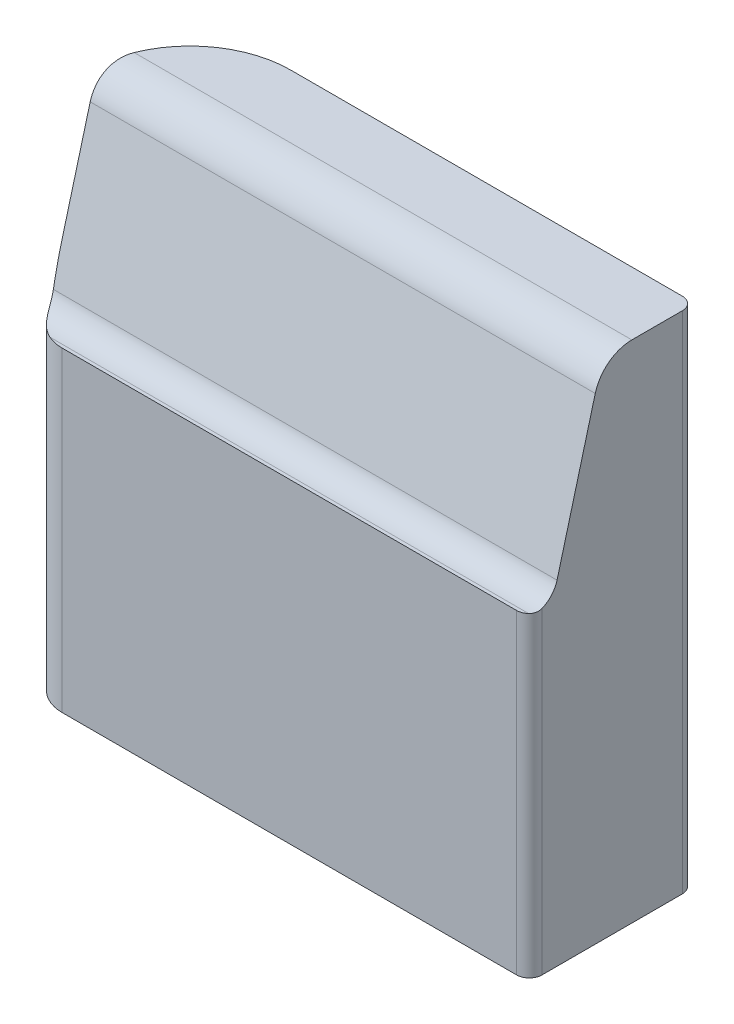
ISO-10303-21;
HEADER;
FILE_DESCRIPTION(('STEP AP214'),'2;1');
FILE_NAME('part.step','',(''),(''),'','','');
FILE_SCHEMA(('AUTOMOTIVE_DESIGN { 1 0 10303 214 1 1 1 1 }'));
ENDSEC;
DATA;
#1=APPLICATION_CONTEXT('core data for automotive mechanical design processes');
#2=APPLICATION_PROTOCOL_DEFINITION('international standard','automotive_design',2000,#1);
#3=PRODUCT_CONTEXT('',#1,'mechanical');
#4=PRODUCT('Part','Part','',(#3));
#5=PRODUCT_RELATED_PRODUCT_CATEGORY('part','',(#4));
#6=PRODUCT_DEFINITION_FORMATION('','',#4);
#7=PRODUCT_DEFINITION_CONTEXT('part definition',#1,'design');
#8=PRODUCT_DEFINITION('design','',#6,#7);
#9=PRODUCT_DEFINITION_SHAPE('','',#8);
#10=(LENGTH_UNIT() NAMED_UNIT(*) SI_UNIT(.MILLI.,.METRE.));
#11=(NAMED_UNIT(*) PLANE_ANGLE_UNIT() SI_UNIT($,.RADIAN.));
#12=(NAMED_UNIT(*) SI_UNIT($,.STERADIAN.) SOLID_ANGLE_UNIT());
#13=UNCERTAINTY_MEASURE_WITH_UNIT(LENGTH_MEASURE(1.E-05),#10,'distance_accuracy_value','');
#14=(GEOMETRIC_REPRESENTATION_CONTEXT(3) GLOBAL_UNCERTAINTY_ASSIGNED_CONTEXT((#13)) GLOBAL_UNIT_ASSIGNED_CONTEXT((#10,
#11,#12)) REPRESENTATION_CONTEXT('',''));
#15=CARTESIAN_POINT('',(0.,0.,0.));
#16=DIRECTION('',(0.,0.,1.));
#17=DIRECTION('',(1.,0.,0.));
#18=AXIS2_PLACEMENT_3D('',#15,#16,#17);
#19=CARTESIAN_POINT('',(20.,-3.,5.));
#20=DIRECTION('',(-1.,0.,0.));
#21=DIRECTION('',(0.,0.,1.));
#22=AXIS2_PLACEMENT_3D('',#19,#20,#21);
#23=CYLINDRICAL_SURFACE('',#22,3.);
#24=DIRECTION('',(-1.,0.,0.));
#25=VECTOR('',#24,1.);
#26=CARTESIAN_POINT('',(20.,0.,5.));
#27=LINE('',#26,#25);
#28=CARTESIAN_POINT('',(20.,0.,5.));
#29=VERTEX_POINT('',#28);
#30=CARTESIAN_POINT('',(-19.4161984870957,0.,5.));
#31=VERTEX_POINT('',#30);
#32=EDGE_CURVE('E184',#29,#31,#27,.T.);
#33=ORIENTED_EDGE('',*,*,#32,.T.);
#34=CARTESIAN_POINT('',(-19.4161984870957,0.,5.));
#35=CARTESIAN_POINT('',(-19.4476398910571,8.44615215946744E-06,5.07769598822021));
#36=CARTESIAN_POINT('',(-19.4778448347174,-0.00301875547096458,5.155905999336));
#37=CARTESIAN_POINT('',(-19.5356515093298,-0.0153183936879546,5.3128258372859));
#38=CARTESIAN_POINT('',(-19.5632522820662,-0.0245931189469453,5.39153583681081));
#39=CARTESIAN_POINT('',(-19.6157162275312,-0.0495711248398902,5.54892712936012));
#40=CARTESIAN_POINT('',(-19.6405773852055,-0.0652790977595611,5.62760835938605));
#41=CARTESIAN_POINT('',(-19.6874565688875,-0.103189547508719,5.78421388711505));
#42=CARTESIAN_POINT('',(-19.7094750016502,-0.125391093708975,5.8621382916306));
#43=CARTESIAN_POINT('',(-19.771329198685,-0.201933977518062,6.09422279218903));
#44=CARTESIAN_POINT('',(-19.8068739890091,-0.266171386367017,6.2464211560772));
#45=CARTESIAN_POINT('',(-19.8669872290354,-0.419842800390661,6.53953554478387));
#46=CARTESIAN_POINT('',(-19.8915692423017,-0.509245445419557,6.68046533324962));
#47=CARTESIAN_POINT('',(-19.9307456722422,-0.707411825846414,6.94164253575932));
#48=CARTESIAN_POINT('',(-19.9456596657797,-0.815388020681755,7.0624413560816));
#49=CARTESIAN_POINT('',(-19.9688210405371,-1.04995090657302,7.28549813096223));
#50=CARTESIAN_POINT('',(-19.9770612888708,-1.17655733931868,7.38773615750423));
#51=CARTESIAN_POINT('',(-19.9861108573365,-1.38001634318352,7.52641157421995));
#52=CARTESIAN_POINT('',(-19.9885878620751,-1.45149140429164,7.57083734672452));
#53=CARTESIAN_POINT('',(-19.9926020993526,-1.59796188968992,7.6535548795928));
#54=CARTESIAN_POINT('',(-19.9941392743925,-1.67295752906751,7.69184626454784));
#55=CARTESIAN_POINT('',(-19.9965356521875,-1.82586769254523,7.76197118100954));
#56=CARTESIAN_POINT('',(-19.9973951939427,-1.90378073669086,7.79380793565077));
#57=CARTESIAN_POINT('',(-19.9986580518514,-2.06200274569308,7.85083227948489));
#58=CARTESIAN_POINT('',(-19.9990613891509,-2.14231159932233,7.8760201768232));
#59=CARTESIAN_POINT('',(-19.9993468831007,-2.22354286469243,7.8977774788672));
#60=B_SPLINE_CURVE_WITH_KNOTS('',3,(#34,#35,#36,#37,#38,#39,#40,#41,#42,#43,#44,#45,#46,#47,#48,
#49,#50,#51,#52,#53,#54,#55,#56,#57,#58,#59),.UNSPECIFIED.,.F.,.F.,(4,2,2,2,2,2,2,2,2,2,2,2,4),
(0.,0.251402016056363,0.502896178728765,0.754574103963112,1.00621597752705,1.51035980882775,
2.01387815194398,2.49976580321802,2.98617208748072,3.23850001379153,3.4908433760256,
3.74306041796446,3.99526576869457),.UNSPECIFIED.);
#61=CARTESIAN_POINT('',(-19.9993468831007,-2.22354286469243,7.8977774788672));
#62=VERTEX_POINT('',#61);
#63=EDGE_CURVE('E259',#31,#62,#60,.T.);
#64=ORIENTED_EDGE('',*,*,#63,.T.);
#65=DIRECTION('',(-1.,0.,0.));
#66=VECTOR('',#65,1.);
#67=CARTESIAN_POINT('',(20.,-2.22354286469243,7.8977774788672));
#68=LINE('',#67,#66);
#69=CARTESIAN_POINT('',(20.,-2.22354286469243,7.8977774788672));
#70=VERTEX_POINT('',#69);
#71=EDGE_CURVE('E201',#70,#62,#68,.T.);
#72=ORIENTED_EDGE('',*,*,#71,.F.);
#73=CARTESIAN_POINT('',(20.,-3.,5.));
#74=DIRECTION('',(1.,0.,0.));
#75=DIRECTION('',(0.,0.,1.));
#76=AXIS2_PLACEMENT_3D('',#73,#74,#75);
#77=CIRCLE('',#76,3.);
#78=EDGE_CURVE('E172',#29,#70,#77,.T.);
#79=ORIENTED_EDGE('',*,*,#78,.F.);
#80=EDGE_LOOP('',(#33,#64,#72,#79));
#81=FACE_BOUND('',#80,.T.);
#82=ADVANCED_FACE('F51',(#81),#23,.T.);
#83=CARTESIAN_POINT('',(20.,-15.,11.3212188504038));
#84=DIRECTION('',(0.,-0.258819045102525,-0.965925826289067));
#85=DIRECTION('',(0.,0.965925826289067,-0.258819045102525));
#86=AXIS2_PLACEMENT_3D('',#83,#84,#85);
#87=PLANE('',#86);
#88=DIRECTION('',(0.,-0.965925826289067,0.258819045102525));
#89=VECTOR('',#88,1.);
#90=CARTESIAN_POINT('',(-20.,-15.,11.3212188504038));
#91=LINE('',#90,#89);
#92=CARTESIAN_POINT('',(-20.,-2.60504250723782,8.));
#93=VERTEX_POINT('',#92);
#94=CARTESIAN_POINT('',(-20.,-10.5169902192837,10.12));
#95=VERTEX_POINT('',#94);
#96=EDGE_CURVE('E171',#93,#95,#91,.T.);
#97=ORIENTED_EDGE('',*,*,#96,.T.);
#98=CARTESIAN_POINT('',(-17.,-10.5169902192837,10.12));
#99=DIRECTION('',(0.,-0.258819045102525,-0.965925826289067));
#100=DIRECTION('',(0.,0.965925826289067,-0.258819045102525));
#101=AXIS2_PLACEMENT_3D('',#98,#99,#100);
#102=ELLIPSE('',#101,11.5911099154686,3.);
#103=CARTESIAN_POINT('',(-19.8902508458796,-13.5176380902051,10.9240211737836));
#104=VERTEX_POINT('',#103);
#105=EDGE_CURVE('E74',#95,#104,#102,.F.);
#106=ORIENTED_EDGE('',*,*,#105,.T.);
#107=DIRECTION('',(-1.,0.,0.));
#108=VECTOR('',#107,1.);
#109=CARTESIAN_POINT('',(20.,-13.5176380902051,10.9240211737836));
#110=LINE('',#109,#108);
#111=CARTESIAN_POINT('',(20.,-13.5176380902051,10.9240211737836));
#112=VERTEX_POINT('',#111);
#113=EDGE_CURVE('E225',#104,#112,#110,.F.);
#114=ORIENTED_EDGE('',*,*,#113,.T.);
#115=DIRECTION('',(0.,-0.965925826289067,0.258819045102525));
#116=VECTOR('',#115,1.);
#117=CARTESIAN_POINT('',(20.,-15.,11.3212188504038));
#118=LINE('',#117,#116);
#119=EDGE_CURVE('E175',#70,#112,#118,.T.);
#120=ORIENTED_EDGE('',*,*,#119,.F.);
#121=ORIENTED_EDGE('',*,*,#71,.T.);
#122=CARTESIAN_POINT('',(-12.,-2.60504250723782,8.));
#123=DIRECTION('',(0.,-0.258819045102525,-0.965925826289067));
#124=DIRECTION('',(0.,-0.965925826289067,0.258819045102525));
#125=AXIS2_PLACEMENT_3D('',#122,#123,#124);
#126=ELLIPSE('',#125,30.9096264412497,8.);
#127=EDGE_CURVE('E265',#62,#93,#126,.F.);
#128=ORIENTED_EDGE('',*,*,#127,.T.);
#129=EDGE_LOOP('',(#97,#106,#114,#120,#121,#128));
#130=FACE_BOUND('',#129,.T.);
#131=ADVANCED_FACE('F255',(#130),#87,.F.);
#132=CARTESIAN_POINT('',(20.,-15.,13.12));
#133=DIRECTION('',(0.,-1.,0.));
#134=DIRECTION('',(0.,0.,-1.));
#135=AXIS2_PLACEMENT_3D('',#132,#133,#134);
#136=PLANE('',#135);
#137=DIRECTION('',(-1.,0.,0.));
#138=VECTOR('',#137,1.);
#139=CARTESIAN_POINT('',(-20.,-15.,12.8558728263617));
#140=LINE('',#139,#138);
#141=CARTESIAN_POINT('',(19.6771197703674,-15.,12.8558728263617));
#142=VERTEX_POINT('',#141);
#143=CARTESIAN_POINT('',(-18.2308533129401,-15.,12.8558728263617));
#144=VERTEX_POINT('',#143);
#145=EDGE_CURVE('E223',#142,#144,#140,.T.);
#146=ORIENTED_EDGE('',*,*,#145,.T.);
#147=CARTESIAN_POINT('',(-17.,-15.,10.12));
#148=DIRECTION('',(0.,-1.,0.));
#149=DIRECTION('',(0.,0.,-1.));
#150=AXIS2_PLACEMENT_3D('',#147,#148,#149);
#151=CIRCLE('',#150,3.);
#152=CARTESIAN_POINT('',(-17.,-15.,13.12));
#153=VERTEX_POINT('',#152);
#154=EDGE_CURVE('E11',#144,#153,#151,.F.);
#155=ORIENTED_EDGE('',*,*,#154,.T.);
#156=DIRECTION('',(-1.,0.,0.));
#157=VECTOR('',#156,1.);
#158=CARTESIAN_POINT('',(20.,-15.,13.12));
#159=LINE('',#158,#157);
#160=CARTESIAN_POINT('',(19.,-15.,13.12));
#161=VERTEX_POINT('',#160);
#162=EDGE_CURVE('E198',#161,#153,#159,.T.);
#163=ORIENTED_EDGE('',*,*,#162,.F.);
#164=CARTESIAN_POINT('',(19.,-15.,12.12));
#165=DIRECTION('',(0.,-1.,0.));
#166=DIRECTION('',(0.,0.,-1.));
#167=AXIS2_PLACEMENT_3D('',#164,#165,#166);
#168=CIRCLE('',#167,1.);
#169=EDGE_CURVE('E220',#161,#142,#168,.F.);
#170=ORIENTED_EDGE('',*,*,#169,.T.);
#171=EDGE_LOOP('',(#146,#155,#163,#170));
#172=FACE_BOUND('',#171,.T.);
#173=ADVANCED_FACE('F311',(#172),#136,.F.);
#174=CARTESIAN_POINT('',(20.,-40.,13.12));
#175=DIRECTION('',(0.,0.,-1.));
#176=DIRECTION('',(-1.,0.,0.));
#177=AXIS2_PLACEMENT_3D('',#174,#175,#176);
#178=PLANE('',#177);
#179=ORIENTED_EDGE('',*,*,#162,.T.);
#180=DIRECTION('',(0.,-1.,0.));
#181=VECTOR('',#180,1.);
#182=CARTESIAN_POINT('',(-17.,-40.,13.12));
#183=LINE('',#182,#181);
#184=CARTESIAN_POINT('',(-17.,-40.,13.12));
#185=VERTEX_POINT('',#184);
#186=EDGE_CURVE('E290',#153,#185,#183,.T.);
#187=ORIENTED_EDGE('',*,*,#186,.T.);
#188=DIRECTION('',(-1.,0.,0.));
#189=VECTOR('',#188,1.);
#190=CARTESIAN_POINT('',(20.,-40.,13.12));
#191=LINE('',#190,#189);
#192=CARTESIAN_POINT('',(19.,-40.,13.12));
#193=VERTEX_POINT('',#192);
#194=EDGE_CURVE('E195',#193,#185,#191,.T.);
#195=ORIENTED_EDGE('',*,*,#194,.F.);
#196=DIRECTION('',(0.,-1.,0.));
#197=VECTOR('',#196,1.);
#198=CARTESIAN_POINT('',(19.,-40.,13.12));
#199=LINE('',#198,#197);
#200=EDGE_CURVE('E218',#193,#161,#199,.F.);
#201=ORIENTED_EDGE('',*,*,#200,.T.);
#202=EDGE_LOOP('',(#179,#187,#195,#201));
#203=FACE_BOUND('',#202,.T.);
#204=ADVANCED_FACE('F314',(#203),#178,.F.);
#205=CARTESIAN_POINT('',(20.,-40.,0.));
#206=DIRECTION('',(0.,1.,0.));
#207=DIRECTION('',(0.,0.,1.));
#208=AXIS2_PLACEMENT_3D('',#205,#206,#207);
#209=PLANE('',#208);
#210=CARTESIAN_POINT('',(13.,-40.,6.56));
#211=DIRECTION('',(0.,-1.,0.));
#212=DIRECTION('',(0.,0.,-1.));
#213=AXIS2_PLACEMENT_3D('',#210,#211,#212);
#214=CIRCLE('',#213,3.025);
#215=CARTESIAN_POINT('',(13.,-40.,3.535));
#216=VERTEX_POINT('',#215);
#217=EDGE_CURVE('E162',#216,#216,#214,.T.);
#218=ORIENTED_EDGE('',*,*,#217,.F.);
#219=EDGE_LOOP('',(#218));
#220=FACE_BOUND('',#219,.T.);
#221=CARTESIAN_POINT('',(-9.86933288150908,-40.,6.56));
#222=DIRECTION('',(0.,-1.,0.));
#223=DIRECTION('',(0.,0.,-1.));
#224=AXIS2_PLACEMENT_3D('',#221,#222,#223);
#225=CIRCLE('',#224,3.025);
#226=CARTESIAN_POINT('',(-9.86933288150908,-40.,3.535));
#227=VERTEX_POINT('',#226);
#228=EDGE_CURVE('E155',#227,#227,#225,.T.);
#229=ORIENTED_EDGE('',*,*,#228,.F.);
#230=EDGE_LOOP('',(#229));
#231=FACE_BOUND('',#230,.T.);
#232=ORIENTED_EDGE('',*,*,#194,.T.);
#233=CARTESIAN_POINT('',(-17.,-40.,10.12));
#234=DIRECTION('',(0.,1.,0.));
#235=DIRECTION('',(0.,0.,1.));
#236=AXIS2_PLACEMENT_3D('',#233,#234,#235);
#237=CIRCLE('',#236,3.);
#238=CARTESIAN_POINT('',(-20.,-40.,10.12));
#239=VERTEX_POINT('',#238);
#240=EDGE_CURVE('E293',#185,#239,#237,.F.);
#241=ORIENTED_EDGE('',*,*,#240,.T.);
#242=DIRECTION('',(0.,0.,-1.));
#243=VECTOR('',#242,1.);
#244=CARTESIAN_POINT('',(-20.,-40.,0.));
#245=LINE('',#244,#243);
#246=CARTESIAN_POINT('',(-20.,-40.,7.99999999999999));
#247=VERTEX_POINT('',#246);
#248=EDGE_CURVE('E176',#239,#247,#245,.T.);
#249=ORIENTED_EDGE('',*,*,#248,.T.);
#250=CARTESIAN_POINT('',(-12.,-40.,7.99999999999999));
#251=DIRECTION('',(0.,1.,0.));
#252=DIRECTION('',(0.,0.,1.));
#253=AXIS2_PLACEMENT_3D('',#250,#251,#252);
#254=CIRCLE('',#253,8.);
#255=CARTESIAN_POINT('',(-12.,-40.,0.));
#256=VERTEX_POINT('',#255);
#257=EDGE_CURVE('E283',#247,#256,#254,.F.);
#258=ORIENTED_EDGE('',*,*,#257,.T.);
#259=DIRECTION('',(-1.,0.,0.));
#260=VECTOR('',#259,1.);
#261=CARTESIAN_POINT('',(20.,-40.,0.));
#262=LINE('',#261,#260);
#263=CARTESIAN_POINT('',(19.,-40.,0.));
#264=VERTEX_POINT('',#263);
#265=EDGE_CURVE('E192',#264,#256,#262,.T.);
#266=ORIENTED_EDGE('',*,*,#265,.F.);
#267=CARTESIAN_POINT('',(19.,-40.,0.999999999999995));
#268=DIRECTION('',(0.,1.,0.));
#269=DIRECTION('',(0.,0.,1.));
#270=AXIS2_PLACEMENT_3D('',#267,#268,#269);
#271=CIRCLE('',#270,1.);
#272=CARTESIAN_POINT('',(20.,-40.,0.999999999999995));
#273=VERTEX_POINT('',#272);
#274=EDGE_CURVE('E216',#264,#273,#271,.F.);
#275=ORIENTED_EDGE('',*,*,#274,.T.);
#276=DIRECTION('',(0.,0.,-1.));
#277=VECTOR('',#276,1.);
#278=CARTESIAN_POINT('',(20.,-40.,0.));
#279=LINE('',#278,#277);
#280=CARTESIAN_POINT('',(20.,-40.,12.12));
#281=VERTEX_POINT('',#280);
#282=EDGE_CURVE('E179',#281,#273,#279,.T.);
#283=ORIENTED_EDGE('',*,*,#282,.F.);
#284=CARTESIAN_POINT('',(19.,-40.,12.12));
#285=DIRECTION('',(0.,1.,0.));
#286=DIRECTION('',(0.,0.,1.));
#287=AXIS2_PLACEMENT_3D('',#284,#285,#286);
#288=CIRCLE('',#287,1.);
#289=EDGE_CURVE('E214',#281,#193,#288,.F.);
#290=ORIENTED_EDGE('',*,*,#289,.T.);
#291=EDGE_LOOP('',(#232,#241,#249,#258,#266,#275,#283,#290));
#292=FACE_BOUND('',#291,.T.);
#293=ADVANCED_FACE('F334',(#220,#231,#292),#209,.F.);
#294=CARTESIAN_POINT('',(20.,0.,0.));
#295=DIRECTION('',(0.,0.,1.));
#296=DIRECTION('',(0.,-1.,0.));
#297=AXIS2_PLACEMENT_3D('',#294,#295,#296);
#298=PLANE('',#297);
#299=ORIENTED_EDGE('',*,*,#265,.T.);
#300=DIRECTION('',(0.,1.,0.));
#301=VECTOR('',#300,1.);
#302=CARTESIAN_POINT('',(-12.,0.,0.));
#303=LINE('',#302,#301);
#304=CARTESIAN_POINT('',(-12.,0.,0.));
#305=VERTEX_POINT('',#304);
#306=EDGE_CURVE('E238',#256,#305,#303,.T.);
#307=ORIENTED_EDGE('',*,*,#306,.T.);
#308=DIRECTION('',(-1.,0.,0.));
#309=VECTOR('',#308,1.);
#310=CARTESIAN_POINT('',(20.,0.,0.));
#311=LINE('',#310,#309);
#312=CARTESIAN_POINT('',(19.,0.,0.));
#313=VERTEX_POINT('',#312);
#314=EDGE_CURVE('E189',#313,#305,#311,.T.);
#315=ORIENTED_EDGE('',*,*,#314,.F.);
#316=DIRECTION('',(0.,1.,0.));
#317=VECTOR('',#316,1.);
#318=CARTESIAN_POINT('',(19.,0.,0.));
#319=LINE('',#318,#317);
#320=EDGE_CURVE('E212',#313,#264,#319,.F.);
#321=ORIENTED_EDGE('',*,*,#320,.T.);
#322=EDGE_LOOP('',(#299,#307,#315,#321));
#323=FACE_BOUND('',#322,.T.);
#324=ADVANCED_FACE('F331',(#323),#298,.F.);
#325=CARTESIAN_POINT('',(20.,0.,5.));
#326=DIRECTION('',(0.,-1.,0.));
#327=DIRECTION('',(0.,0.,-1.));
#328=AXIS2_PLACEMENT_3D('',#325,#326,#327);
#329=PLANE('',#328);
#330=ORIENTED_EDGE('',*,*,#314,.T.);
#331=CARTESIAN_POINT('',(-12.,0.,8.));
#332=DIRECTION('',(0.,-1.,0.));
#333=DIRECTION('',(0.,0.,-1.));
#334=AXIS2_PLACEMENT_3D('',#331,#332,#333);
#335=CIRCLE('',#334,8.);
#336=EDGE_CURVE('E266',#305,#31,#335,.F.);
#337=ORIENTED_EDGE('',*,*,#336,.T.);
#338=ORIENTED_EDGE('',*,*,#32,.F.);
#339=DIRECTION('',(0.,0.,1.));
#340=VECTOR('',#339,1.);
#341=CARTESIAN_POINT('',(20.,0.,5.));
#342=LINE('',#341,#340);
#343=CARTESIAN_POINT('',(20.,0.,1.));
#344=VERTEX_POINT('',#343);
#345=EDGE_CURVE('E182',#344,#29,#342,.T.);
#346=ORIENTED_EDGE('',*,*,#345,.F.);
#347=CARTESIAN_POINT('',(19.,0.,1.));
#348=DIRECTION('',(0.,-1.,0.));
#349=DIRECTION('',(0.,0.,-1.));
#350=AXIS2_PLACEMENT_3D('',#347,#348,#349);
#351=CIRCLE('',#350,1.);
#352=EDGE_CURVE('E210',#344,#313,#351,.F.);
#353=ORIENTED_EDGE('',*,*,#352,.T.);
#354=EDGE_LOOP('',(#330,#337,#338,#346,#353));
#355=FACE_BOUND('',#354,.T.);
#356=ADVANCED_FACE('F328',(#355),#329,.F.);
#357=CARTESIAN_POINT('',(20.,-3.,5.));
#358=DIRECTION('',(-1.,0.,0.));
#359=DIRECTION('',(0.,0.,1.));
#360=AXIS2_PLACEMENT_3D('',#357,#358,#359);
#361=PLANE('',#360);
#362=ORIENTED_EDGE('',*,*,#282,.T.);
#363=DIRECTION('',(0.,1.,0.));
#364=VECTOR('',#363,1.);
#365=CARTESIAN_POINT('',(20.,-3.,1.));
#366=LINE('',#365,#364);
#367=EDGE_CURVE('E207',#273,#344,#366,.T.);
#368=ORIENTED_EDGE('',*,*,#367,.T.);
#369=ORIENTED_EDGE('',*,*,#345,.T.);
#370=ORIENTED_EDGE('',*,*,#78,.T.);
#371=ORIENTED_EDGE('',*,*,#119,.T.);
#372=CARTESIAN_POINT('',(20.,-13.,12.8558728263617));
#373=DIRECTION('',(-1.,0.,0.));
#374=DIRECTION('',(0.,0.,1.));
#375=AXIS2_PLACEMENT_3D('',#372,#373,#374);
#376=CIRCLE('',#375,2.);
#377=CARTESIAN_POINT('',(20.,-14.859701907141,12.12));
#378=VERTEX_POINT('',#377);
#379=EDGE_CURVE('E227',#112,#378,#376,.T.);
#380=ORIENTED_EDGE('',*,*,#379,.T.);
#381=DIRECTION('',(0.,-1.,0.));
#382=VECTOR('',#381,1.);
#383=CARTESIAN_POINT('',(20.,-3.,12.12));
#384=LINE('',#383,#382);
#385=EDGE_CURVE('E204',#378,#281,#384,.T.);
#386=ORIENTED_EDGE('',*,*,#385,.T.);
#387=EDGE_LOOP('',(#362,#368,#369,#370,#371,#380,#386));
#388=FACE_BOUND('',#387,.T.);
#389=ADVANCED_FACE('F320',(#388),#361,.F.);
#390=CARTESIAN_POINT('',(-20.,-3.,5.));
#391=DIRECTION('',(-1.,0.,0.));
#392=DIRECTION('',(0.,0.,1.));
#393=AXIS2_PLACEMENT_3D('',#390,#391,#392);
#394=PLANE('',#393);
#395=ORIENTED_EDGE('',*,*,#248,.F.);
#396=DIRECTION('',(0.,-1.,0.));
#397=VECTOR('',#396,1.);
#398=CARTESIAN_POINT('',(-20.,-15.,10.12));
#399=LINE('',#398,#397);
#400=EDGE_CURVE('E297',#239,#95,#399,.F.);
#401=ORIENTED_EDGE('',*,*,#400,.T.);
#402=ORIENTED_EDGE('',*,*,#96,.F.);
#403=DIRECTION('',(0.,1.,0.));
#404=VECTOR('',#403,1.);
#405=CARTESIAN_POINT('',(-20.,-40.,7.99999999999999));
#406=LINE('',#405,#404);
#407=EDGE_CURVE('E286',#93,#247,#406,.F.);
#408=ORIENTED_EDGE('',*,*,#407,.T.);
#409=EDGE_LOOP('',(#395,#401,#402,#408));
#410=FACE_BOUND('',#409,.T.);
#411=ADVANCED_FACE('F250',(#410),#394,.T.);
#412=CARTESIAN_POINT('',(19.,-3.,1.));
#413=DIRECTION('',(0.,1.,0.));
#414=DIRECTION('',(0.,0.,1.));
#415=AXIS2_PLACEMENT_3D('',#412,#413,#414);
#416=CYLINDRICAL_SURFACE('',#415,1.);
#417=ORIENTED_EDGE('',*,*,#274,.F.);
#418=ORIENTED_EDGE('',*,*,#320,.F.);
#419=ORIENTED_EDGE('',*,*,#352,.F.);
#420=ORIENTED_EDGE('',*,*,#367,.F.);
#421=EDGE_LOOP('',(#417,#418,#419,#420));
#422=FACE_BOUND('',#421,.T.);
#423=ADVANCED_FACE('F246',(#422),#416,.T.);
#424=CARTESIAN_POINT('',(19.,-3.,12.12));
#425=DIRECTION('',(0.,-1.,0.));
#426=DIRECTION('',(0.,0.,-1.));
#427=AXIS2_PLACEMENT_3D('',#424,#425,#426);
#428=CYLINDRICAL_SURFACE('',#427,1.);
#429=ORIENTED_EDGE('',*,*,#169,.F.);
#430=ORIENTED_EDGE('',*,*,#200,.F.);
#431=ORIENTED_EDGE('',*,*,#289,.F.);
#432=ORIENTED_EDGE('',*,*,#385,.F.);
#433=CARTESIAN_POINT('',(20.,-14.859701907141,12.12));
#434=CARTESIAN_POINT('',(20.0000001935486,-14.8694118321477,12.1445336772066));
#435=CARTESIAN_POINT('',(19.9990961202643,-14.8786290822711,12.1692538622716));
#436=CARTESIAN_POINT('',(19.9954074262291,-14.8960442418709,12.2189203735111));
#437=CARTESIAN_POINT('',(19.9926221807557,-14.9042418116482,12.2438667720934));
#438=CARTESIAN_POINT('',(19.9813563280003,-14.9272063096947,12.3186748128191));
#439=CARTESIAN_POINT('',(19.9699663008288,-14.9403941075581,12.3686299622683));
#440=CARTESIAN_POINT('',(19.9392353942119,-14.9625121243205,12.4671459415411));
#441=CARTESIAN_POINT('',(19.9198730420564,-14.9714307030877,12.5157026238672));
#442=CARTESIAN_POINT('',(19.8735117148591,-14.9853472100168,12.6096058643525));
#443=CARTESIAN_POINT('',(19.8465177936764,-14.9903477246034,12.6549545221994));
#444=CARTESIAN_POINT('',(19.7957947413132,-14.9960248965357,12.7265859145127));
#445=CARTESIAN_POINT('',(19.7739802106266,-14.9975874644007,12.7541825327519));
#446=CARTESIAN_POINT('',(19.7275716768204,-14.9995752885075,12.8069313631768));
#447=CARTESIAN_POINT('',(19.7029802746172,-15.0000015999472,12.8320858223645));
#448=CARTESIAN_POINT('',(19.6771197703674,-15.,12.8558728263617));
#449=B_SPLINE_CURVE_WITH_KNOTS('',3,(#433,#434,#435,#436,#437,#438,#439,#440,#441,#442,#443,
#444,#445,#446,#447,#448),.UNSPECIFIED.,.F.,.F.,(4,2,2,2,2,2,2,4),(0.,0.0791166270435355,
0.158259541030067,0.31614837990305,0.474465288657007,0.632677599697184,0.738114478953398,
0.843453408855515),.UNSPECIFIED.);
#450=EDGE_CURVE('E230',#378,#142,#449,.T.);
#451=ORIENTED_EDGE('',*,*,#450,.T.);
#452=EDGE_LOOP('',(#429,#430,#431,#432,#451));
#453=FACE_BOUND('',#452,.T.);
#454=ADVANCED_FACE('F242',(#453),#428,.T.);
#455=CARTESIAN_POINT('',(20.,-13.,12.8558728263617));
#456=DIRECTION('',(1.,0.,0.));
#457=DIRECTION('',(0.,0.,-1.));
#458=AXIS2_PLACEMENT_3D('',#455,#456,#457);
#459=CYLINDRICAL_SURFACE('',#458,2.);
#460=ORIENTED_EDGE('',*,*,#113,.F.);
#461=CARTESIAN_POINT('',(-19.8902508458796,-13.5176380902051,10.9240211737836));
#462=CARTESIAN_POINT('',(-19.8864984296544,-13.5679024690481,10.9374821393241));
#463=CARTESIAN_POINT('',(-19.8821137576885,-13.617594800411,10.9529068636914));
#464=CARTESIAN_POINT('',(-19.8718889609612,-13.7155058227396,10.9875203556151));
#465=CARTESIAN_POINT('',(-19.866048586985,-13.7637242597876,11.0067097675628));
#466=CARTESIAN_POINT('',(-19.8527187656465,-13.8583677208284,11.0486965126411));
#467=CARTESIAN_POINT('',(-19.8452283711467,-13.9047916967081,11.071495915841));
#468=CARTESIAN_POINT('',(-19.8283883063497,-13.9954649809607,11.1204451175746));
#469=CARTESIAN_POINT('',(-19.8190387844384,-14.0397144625393,11.1465946486593));
#470=CARTESIAN_POINT('',(-19.7878076820762,-14.1689009275919,11.2297931151599));
#471=CARTESIAN_POINT('',(-19.7627588115595,-14.2501578989886,11.2915390558909));
#472=CARTESIAN_POINT('',(-19.7026104810142,-14.4002184284027,11.4242918273325));
#473=CARTESIAN_POINT('',(-19.6675237346196,-14.4690375609777,11.4952868818681));
#474=CARTESIAN_POINT('',(-19.5875186909825,-14.590948802466,11.6403196525287));
#475=CARTESIAN_POINT('',(-19.5429505176711,-14.6444733165972,11.7141875648768));
#476=CARTESIAN_POINT('',(-19.4432913425453,-14.7384288630486,11.8630855901346));
#477=CARTESIAN_POINT('',(-19.3882000986102,-14.778859594042,11.9381157297491));
#478=CARTESIAN_POINT('',(-19.266847409256,-14.848372753709,12.0874539281945));
#479=CARTESIAN_POINT('',(-19.200359781537,-14.8771752097177,12.161706452728));
#480=CARTESIAN_POINT('',(-19.0582460461143,-14.9240943623681,12.3049087979308));
#481=CARTESIAN_POINT('',(-18.9825991151235,-14.9421861376783,12.3738459295398));
#482=CARTESIAN_POINT('',(-18.8523172324221,-14.9649756511824,12.480778185869));
#483=CARTESIAN_POINT('',(-18.7998870801666,-14.9721501461677,12.5209975578941));
#484=CARTESIAN_POINT('',(-18.6922495821686,-14.9836928690933,12.5980373393276));
#485=CARTESIAN_POINT('',(-18.6370409642348,-14.9880597986782,12.634856169429));
#486=CARTESIAN_POINT('',(-18.524486527815,-14.9945802508804,12.7046285116539));
#487=CARTESIAN_POINT('',(-18.4671521735438,-14.9967442431846,12.7375996415625));
#488=CARTESIAN_POINT('',(-18.3504580981743,-14.9994487404871,12.7996706313424));
#489=CARTESIAN_POINT('',(-18.2911004279551,-14.9999908427221,12.8287742728982));
#490=CARTESIAN_POINT('',(-18.2308533129401,-15.,12.8558728263617));
#491=B_SPLINE_CURVE_WITH_KNOTS('',3,(#461,#462,#463,#464,#465,#466,#467,#468,#469,#470,#471,
#472,#473,#474,#475,#476,#477,#478,#479,#480,#481,#482,#483,#484,#485,#486,#487,#488,#489,#490),
.UNSPECIFIED.,.F.,.F.,(4,2,2,2,2,2,2,2,2,2,2,2,2,2,4),(0.,0.156469621218463,0.312966048315225,
0.46955254198884,0.626126542750246,0.939660200156916,1.25279849131873,1.55592710613385,
1.85906269634071,2.16911469203573,2.47988530176882,2.67910188119097,2.87841052195617,
3.07676744218054,3.27492895619583),.UNSPECIFIED.);
#492=EDGE_CURVE('E60',#104,#144,#491,.T.);
#493=ORIENTED_EDGE('',*,*,#492,.T.);
#494=ORIENTED_EDGE('',*,*,#145,.F.);
#495=ORIENTED_EDGE('',*,*,#450,.F.);
#496=ORIENTED_EDGE('',*,*,#379,.F.);
#497=EDGE_LOOP('',(#460,#493,#494,#495,#496));
#498=FACE_BOUND('',#497,.T.);
#499=ADVANCED_FACE('F240',(#498),#459,.F.);
#500=CARTESIAN_POINT('',(-12.,0.,8.));
#501=DIRECTION('',(0.,-1.,0.));
#502=DIRECTION('',(0.,0.,-1.));
#503=AXIS2_PLACEMENT_3D('',#500,#501,#502);
#504=CYLINDRICAL_SURFACE('',#503,8.);
#505=ORIENTED_EDGE('',*,*,#257,.F.);
#506=ORIENTED_EDGE('',*,*,#407,.F.);
#507=ORIENTED_EDGE('',*,*,#127,.F.);
#508=ORIENTED_EDGE('',*,*,#63,.F.);
#509=ORIENTED_EDGE('',*,*,#336,.F.);
#510=ORIENTED_EDGE('',*,*,#306,.F.);
#511=EDGE_LOOP('',(#505,#506,#507,#508,#509,#510));
#512=FACE_BOUND('',#511,.T.);
#513=ADVANCED_FACE('F268',(#512),#504,.T.);
#514=CARTESIAN_POINT('',(-17.,-40.,10.12));
#515=DIRECTION('',(0.,1.,0.));
#516=DIRECTION('',(0.,0.,1.));
#517=AXIS2_PLACEMENT_3D('',#514,#515,#516);
#518=CYLINDRICAL_SURFACE('',#517,3.);
#519=ORIENTED_EDGE('',*,*,#105,.F.);
#520=ORIENTED_EDGE('',*,*,#400,.F.);
#521=ORIENTED_EDGE('',*,*,#240,.F.);
#522=ORIENTED_EDGE('',*,*,#186,.F.);
#523=ORIENTED_EDGE('',*,*,#154,.F.);
#524=ORIENTED_EDGE('',*,*,#492,.F.);
#525=EDGE_LOOP('',(#519,#520,#521,#522,#523,#524));
#526=FACE_BOUND('',#525,.T.);
#527=ADVANCED_FACE('F53',(#526),#518,.T.);
#528=CARTESIAN_POINT('',(-9.86933288150908,-25.,6.56));
#529=DIRECTION('',(0.,-1.,0.));
#530=DIRECTION('',(0.,0.,-1.));
#531=AXIS2_PLACEMENT_3D('',#528,#529,#530);
#532=CONICAL_SURFACE('',#531,2.49999999999999,1.02974425867665);
#533=CARTESIAN_POINT('',(-9.86933288150908,-23.4978484524311,6.56));
#534=VERTEX_POINT('',#533);
#535=VERTEX_LOOP('',#534);
#536=FACE_BOUND('',#535,.T.);
#537=CARTESIAN_POINT('',(-9.86933288150908,-25.,6.56));
#538=DIRECTION('',(0.,-1.,0.));
#539=DIRECTION('',(0.,0.,-1.));
#540=AXIS2_PLACEMENT_3D('',#537,#538,#539);
#541=CIRCLE('',#540,2.49999999999999);
#542=CARTESIAN_POINT('',(-9.86933288150908,-25.,4.06000000000001));
#543=VERTEX_POINT('',#542);
#544=EDGE_CURVE('E168',#543,#543,#541,.T.);
#545=ORIENTED_EDGE('',*,*,#544,.T.);
#546=EDGE_LOOP('',(#545));
#547=FACE_BOUND('',#546,.T.);
#548=ADVANCED_FACE('F277',(#536,#547),#532,.F.);
#549=CARTESIAN_POINT('',(-9.86933288150908,-40.,6.56));
#550=DIRECTION('',(0.,-1.,0.));
#551=DIRECTION('',(0.,0.,-1.));
#552=AXIS2_PLACEMENT_3D('',#549,#550,#551);
#553=CYLINDRICAL_SURFACE('',#552,2.49999999999999);
#554=ORIENTED_EDGE('',*,*,#544,.F.);
#555=EDGE_LOOP('',(#554));
#556=FACE_BOUND('',#555,.T.);
#557=CARTESIAN_POINT('',(-9.86933288150908,-39.475,6.56));
#558=DIRECTION('',(0.,-1.,0.));
#559=DIRECTION('',(0.,0.,-1.));
#560=AXIS2_PLACEMENT_3D('',#557,#558,#559);
#561=CIRCLE('',#560,2.5);
#562=CARTESIAN_POINT('',(-9.86933288150908,-39.475,4.06));
#563=VERTEX_POINT('',#562);
#564=EDGE_CURVE('E159',#563,#563,#561,.T.);
#565=ORIENTED_EDGE('',*,*,#564,.T.);
#566=EDGE_LOOP('',(#565));
#567=FACE_BOUND('',#566,.T.);
#568=ADVANCED_FACE('F441',(#556,#567),#553,.F.);
#569=CARTESIAN_POINT('',(-9.86933288150908,-40.,6.56));
#570=DIRECTION('',(0.,-1.,0.));
#571=DIRECTION('',(0.,0.,-1.));
#572=AXIS2_PLACEMENT_3D('',#569,#570,#571);
#573=CONICAL_SURFACE('',#572,3.025,0.785398163397445);
#574=ORIENTED_EDGE('',*,*,#564,.F.);
#575=EDGE_LOOP('',(#574));
#576=FACE_BOUND('',#575,.T.);
#577=ORIENTED_EDGE('',*,*,#228,.T.);
#578=EDGE_LOOP('',(#577));
#579=FACE_BOUND('',#578,.T.);
#580=ADVANCED_FACE('F149',(#576,#579),#573,.F.);
#581=CARTESIAN_POINT('',(13.,-25.,6.56));
#582=DIRECTION('',(0.,-1.,0.));
#583=DIRECTION('',(0.,0.,-1.));
#584=AXIS2_PLACEMENT_3D('',#581,#582,#583);
#585=CONICAL_SURFACE('',#584,2.49999999999999,1.02974425867665);
#586=CARTESIAN_POINT('',(13.,-23.4978484524311,6.56));
#587=VERTEX_POINT('',#586);
#588=VERTEX_LOOP('',#587);
#589=FACE_BOUND('',#588,.T.);
#590=CARTESIAN_POINT('',(13.,-25.,6.56));
#591=DIRECTION('',(0.,-1.,0.));
#592=DIRECTION('',(0.,0.,-1.));
#593=AXIS2_PLACEMENT_3D('',#590,#591,#592);
#594=CIRCLE('',#593,2.49999999999999);
#595=CARTESIAN_POINT('',(13.,-25.,4.06000000000001));
#596=VERTEX_POINT('',#595);
#597=EDGE_CURVE('E153',#596,#596,#594,.T.);
#598=ORIENTED_EDGE('',*,*,#597,.T.);
#599=EDGE_LOOP('',(#598));
#600=FACE_BOUND('',#599,.T.);
#601=ADVANCED_FACE('F145',(#589,#600),#585,.F.);
#602=CARTESIAN_POINT('',(13.,-40.,6.56));
#603=DIRECTION('',(0.,-1.,0.));
#604=DIRECTION('',(0.,0.,-1.));
#605=AXIS2_PLACEMENT_3D('',#602,#603,#604);
#606=CYLINDRICAL_SURFACE('',#605,2.49999999999999);
#607=ORIENTED_EDGE('',*,*,#597,.F.);
#608=EDGE_LOOP('',(#607));
#609=FACE_BOUND('',#608,.T.);
#610=CARTESIAN_POINT('',(13.,-39.475,6.56));
#611=DIRECTION('',(0.,-1.,0.));
#612=DIRECTION('',(0.,0.,-1.));
#613=AXIS2_PLACEMENT_3D('',#610,#611,#612);
#614=CIRCLE('',#613,2.5);
#615=CARTESIAN_POINT('',(13.,-39.475,4.06));
#616=VERTEX_POINT('',#615);
#617=EDGE_CURVE('E156',#616,#616,#614,.T.);
#618=ORIENTED_EDGE('',*,*,#617,.T.);
#619=EDGE_LOOP('',(#618));
#620=FACE_BOUND('',#619,.T.);
#621=ADVANCED_FACE('F148',(#609,#620),#606,.F.);
#622=CARTESIAN_POINT('',(13.,-40.,6.56));
#623=DIRECTION('',(0.,-1.,0.));
#624=DIRECTION('',(0.,0.,-1.));
#625=AXIS2_PLACEMENT_3D('',#622,#623,#624);
#626=CONICAL_SURFACE('',#625,3.025,0.785398163397445);
#627=ORIENTED_EDGE('',*,*,#617,.F.);
#628=EDGE_LOOP('',(#627));
#629=FACE_BOUND('',#628,.T.);
#630=ORIENTED_EDGE('',*,*,#217,.T.);
#631=EDGE_LOOP('',(#630));
#632=FACE_BOUND('',#631,.T.);
#633=ADVANCED_FACE('F479',(#629,#632),#626,.F.);
#634=CLOSED_SHELL('',(#82,#131,#173,#204,#293,#324,#356,#389,#411,#423,#454,#499,#513,#527,#548,
#568,#580,#601,#621,#633));
#635=MANIFOLD_SOLID_BREP('B2',#634);
#636=ADVANCED_BREP_SHAPE_REPRESENTATION('',(#18,#635),#14);
#637=SHAPE_DEFINITION_REPRESENTATION(#9,#636);
ENDSEC;
END-ISO-10303-21;
